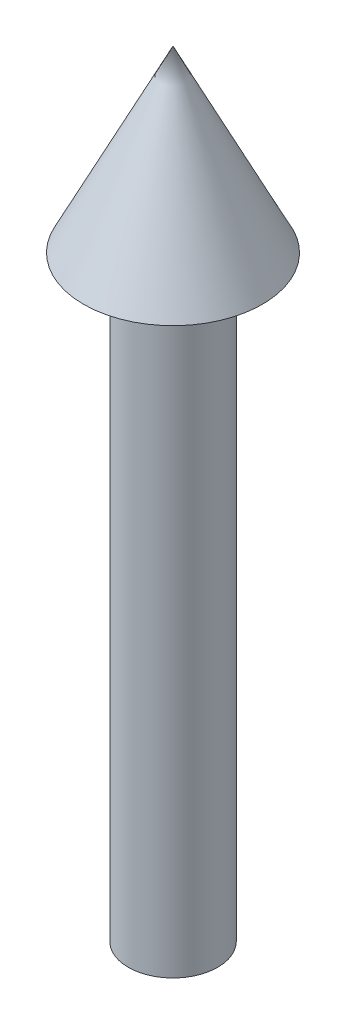
ISO-10303-21;
HEADER;
FILE_DESCRIPTION(('STEP AP214'),'2;1');
FILE_NAME('part.step','',(''),(''),'','','');
FILE_SCHEMA(('AUTOMOTIVE_DESIGN { 1 0 10303 214 1 1 1 1 }'));
ENDSEC;
DATA;
#1=APPLICATION_CONTEXT('core data for automotive mechanical design processes');
#2=APPLICATION_PROTOCOL_DEFINITION('international standard','automotive_design',2000,#1);
#3=PRODUCT_CONTEXT('',#1,'mechanical');
#4=PRODUCT('Part','Part','',(#3));
#5=PRODUCT_RELATED_PRODUCT_CATEGORY('part','',(#4));
#6=PRODUCT_DEFINITION_FORMATION('','',#4);
#7=PRODUCT_DEFINITION_CONTEXT('part definition',#1,'design');
#8=PRODUCT_DEFINITION('design','',#6,#7);
#9=PRODUCT_DEFINITION_SHAPE('','',#8);
#10=(LENGTH_UNIT() NAMED_UNIT(*) SI_UNIT(.MILLI.,.METRE.));
#11=(NAMED_UNIT(*) PLANE_ANGLE_UNIT() SI_UNIT($,.RADIAN.));
#12=(NAMED_UNIT(*) SI_UNIT($,.STERADIAN.) SOLID_ANGLE_UNIT());
#13=UNCERTAINTY_MEASURE_WITH_UNIT(LENGTH_MEASURE(1.E-05),#10,'distance_accuracy_value','');
#14=(GEOMETRIC_REPRESENTATION_CONTEXT(3) GLOBAL_UNCERTAINTY_ASSIGNED_CONTEXT((#13)) GLOBAL_UNIT_ASSIGNED_CONTEXT((#10,
#11,#12)) REPRESENTATION_CONTEXT('',''));
#15=CARTESIAN_POINT('',(0.,0.,0.));
#16=DIRECTION('',(0.,0.,1.));
#17=DIRECTION('',(1.,0.,0.));
#18=AXIS2_PLACEMENT_3D('',#15,#16,#17);
#19=CARTESIAN_POINT('',(0.,20.,0.));
#20=DIRECTION('',(0.,-1.,0.));
#21=DIRECTION('',(0.,0.,-1.));
#22=AXIS2_PLACEMENT_3D('',#19,#20,#21);
#23=CYLINDRICAL_SURFACE('',#22,1.5);
#24=CARTESIAN_POINT('',(0.,20.,0.));
#25=DIRECTION('',(0.,1.,0.));
#26=DIRECTION('',(0.,0.,1.));
#27=AXIS2_PLACEMENT_3D('',#24,#25,#26);
#28=CIRCLE('',#27,1.5);
#29=CARTESIAN_POINT('',(0.,20.,1.5));
#30=VERTEX_POINT('',#29);
#31=EDGE_CURVE('E11',#30,#30,#28,.T.);
#32=ORIENTED_EDGE('',*,*,#31,.F.);
#33=EDGE_LOOP('',(#32));
#34=FACE_BOUND('',#33,.T.);
#35=CARTESIAN_POINT('',(0.,0.,0.));
#36=DIRECTION('',(0.,1.,0.));
#37=DIRECTION('',(0.,0.,1.));
#38=AXIS2_PLACEMENT_3D('',#35,#36,#37);
#39=CIRCLE('',#38,1.5);
#40=CARTESIAN_POINT('',(0.,0.,1.5));
#41=VERTEX_POINT('',#40);
#42=EDGE_CURVE('E35',#41,#41,#39,.T.);
#43=ORIENTED_EDGE('',*,*,#42,.T.);
#44=EDGE_LOOP('',(#43));
#45=FACE_BOUND('',#44,.T.);
#46=ADVANCED_FACE('F32',(#34,#45),#23,.T.);
#47=CARTESIAN_POINT('',(0.,0.,0.));
#48=DIRECTION('',(0.,1.,0.));
#49=DIRECTION('',(0.,0.,1.));
#50=AXIS2_PLACEMENT_3D('',#47,#48,#49);
#51=PLANE('',#50);
#52=ORIENTED_EDGE('',*,*,#42,.F.);
#53=EDGE_LOOP('',(#52));
#54=FACE_BOUND('',#53,.T.);
#55=ADVANCED_FACE('F49',(#54),#51,.F.);
#56=CARTESIAN_POINT('',(0.,20.,0.));
#57=DIRECTION('',(0.,-1.,0.));
#58=DIRECTION('',(0.,0.,-1.));
#59=AXIS2_PLACEMENT_3D('',#56,#57,#58);
#60=PLANE('',#59);
#61=ORIENTED_EDGE('',*,*,#31,.T.);
#62=EDGE_LOOP('',(#61));
#63=FACE_BOUND('',#62,.T.);
#64=CARTESIAN_POINT('',(0.,20.,0.));
#65=DIRECTION('',(0.,1.,0.));
#66=DIRECTION('',(0.,0.,1.));
#67=AXIS2_PLACEMENT_3D('',#64,#65,#66);
#68=CIRCLE('',#67,3.);
#69=CARTESIAN_POINT('',(0.,20.,3.));
#70=VERTEX_POINT('',#69);
#71=EDGE_CURVE('E63',#70,#70,#68,.T.);
#72=ORIENTED_EDGE('',*,*,#71,.F.);
#73=EDGE_LOOP('',(#72));
#74=FACE_BOUND('',#73,.T.);
#75=ADVANCED_FACE('F43',(#63,#74),#60,.T.);
#76=CARTESIAN_POINT('',(0.,26.,0.));
#77=DIRECTION('',(0.,-1.,0.));
#78=DIRECTION('',(0.,0.,-1.));
#79=AXIS2_PLACEMENT_3D('',#76,#77,#78);
#80=CONICAL_SURFACE('',#79,0.,0.463647609000806);
#81=ORIENTED_EDGE('',*,*,#71,.T.);
#82=EDGE_LOOP('',(#81));
#83=FACE_BOUND('',#82,.T.);
#84=CARTESIAN_POINT('',(0.,26.,0.));
#85=VERTEX_POINT('',#84);
#86=VERTEX_LOOP('',#85);
#87=FACE_BOUND('',#86,.T.);
#88=ADVANCED_FACE('F41',(#83,#87),#80,.T.);
#89=CLOSED_SHELL('',(#46,#55,#75,#88));
#90=MANIFOLD_SOLID_BREP('B2',#89);
#91=ADVANCED_BREP_SHAPE_REPRESENTATION('',(#18,#90),#14);
#92=SHAPE_DEFINITION_REPRESENTATION(#9,#91);
ENDSEC;
END-ISO-10303-21;
